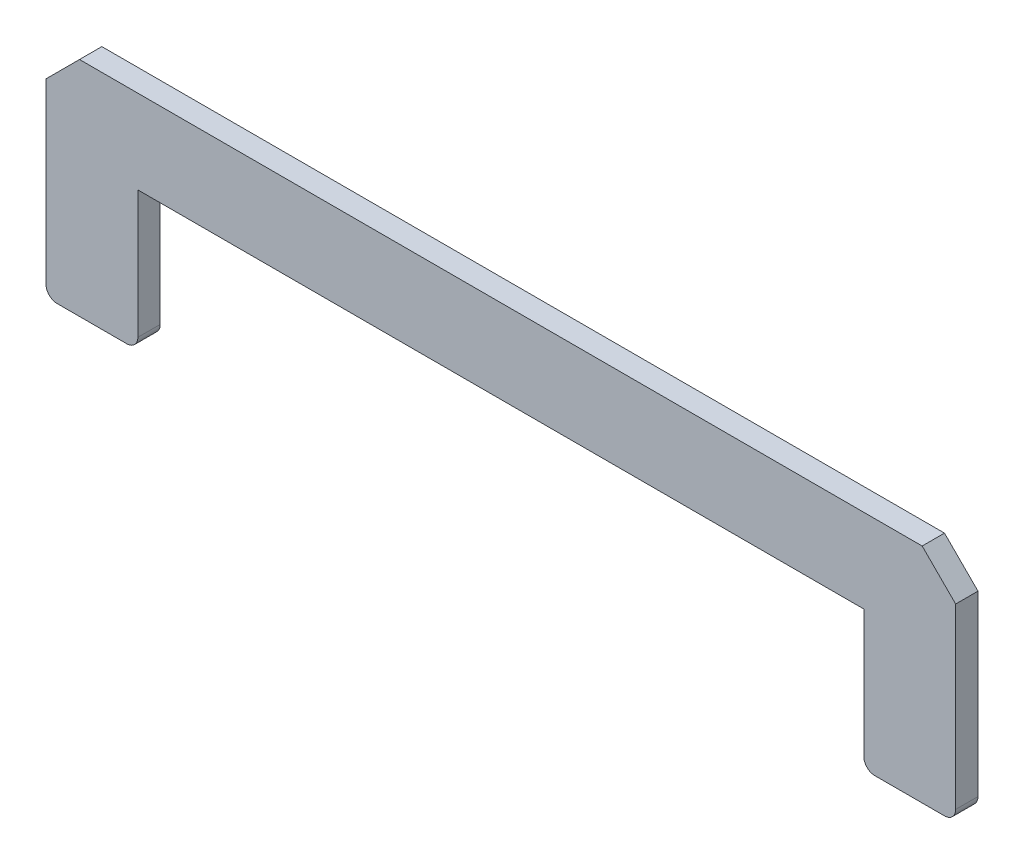
ISO-10303-21;
HEADER;
FILE_DESCRIPTION(('STEP AP214'),'2;1');
FILE_NAME('part.step','',(''),(''),'','','');
FILE_SCHEMA(('AUTOMOTIVE_DESIGN { 1 0 10303 214 1 1 1 1 }'));
ENDSEC;
DATA;
#1=APPLICATION_CONTEXT('core data for automotive mechanical design processes');
#2=APPLICATION_PROTOCOL_DEFINITION('international standard','automotive_design',2000,#1);
#3=PRODUCT_CONTEXT('',#1,'mechanical');
#4=PRODUCT('Part','Part','',(#3));
#5=PRODUCT_RELATED_PRODUCT_CATEGORY('part','',(#4));
#6=PRODUCT_DEFINITION_FORMATION('','',#4);
#7=PRODUCT_DEFINITION_CONTEXT('part definition',#1,'design');
#8=PRODUCT_DEFINITION('design','',#6,#7);
#9=PRODUCT_DEFINITION_SHAPE('','',#8);
#10=(LENGTH_UNIT() NAMED_UNIT(*) SI_UNIT(.MILLI.,.METRE.));
#11=(NAMED_UNIT(*) PLANE_ANGLE_UNIT() SI_UNIT($,.RADIAN.));
#12=(NAMED_UNIT(*) SI_UNIT($,.STERADIAN.) SOLID_ANGLE_UNIT());
#13=UNCERTAINTY_MEASURE_WITH_UNIT(LENGTH_MEASURE(1.E-05),#10,'distance_accuracy_value','');
#14=(GEOMETRIC_REPRESENTATION_CONTEXT(3) GLOBAL_UNCERTAINTY_ASSIGNED_CONTEXT((#13)) GLOBAL_UNIT_ASSIGNED_CONTEXT((#10,
#11,#12)) REPRESENTATION_CONTEXT('',''));
#15=CARTESIAN_POINT('',(0.,0.,0.));
#16=DIRECTION('',(0.,0.,1.));
#17=DIRECTION('',(1.,0.,0.));
#18=AXIS2_PLACEMENT_3D('',#15,#16,#17);
#19=CARTESIAN_POINT('',(16.2941,0.,2.54));
#20=DIRECTION('',(-1.,0.,0.));
#21=DIRECTION('',(0.,-1.,0.));
#22=AXIS2_PLACEMENT_3D('',#19,#20,#21);
#23=PLANE('',#22);
#24=DIRECTION('',(0.,1.,0.));
#25=VECTOR('',#24,1.);
#26=CARTESIAN_POINT('',(16.2941,0.,2.54));
#27=LINE('',#26,#25);
#28=CARTESIAN_POINT('',(16.2941,19.2651924354634,2.54));
#29=VERTEX_POINT('',#28);
#30=CARTESIAN_POINT('',(16.2941,33.782,2.54));
#31=VERTEX_POINT('',#30);
#32=EDGE_CURVE('E135',#29,#31,#27,.T.);
#33=ORIENTED_EDGE('',*,*,#32,.F.);
#34=DIRECTION('',(0.,0.,1.));
#35=VECTOR('',#34,1.);
#36=CARTESIAN_POINT('',(16.2941,19.2651924354634,2.54));
#37=LINE('',#36,#35);
#38=CARTESIAN_POINT('',(16.2941,19.2651924354634,0.));
#39=VERTEX_POINT('',#38);
#40=EDGE_CURVE('E11',#29,#39,#37,.F.);
#41=ORIENTED_EDGE('',*,*,#40,.T.);
#42=DIRECTION('',(0.,1.,0.));
#43=VECTOR('',#42,1.);
#44=CARTESIAN_POINT('',(16.2941,0.,0.));
#45=LINE('',#44,#43);
#46=CARTESIAN_POINT('',(16.2941,33.782,0.));
#47=VERTEX_POINT('',#46);
#48=EDGE_CURVE('E159',#39,#47,#45,.T.);
#49=ORIENTED_EDGE('',*,*,#48,.T.);
#50=DIRECTION('',(0.,0.,-1.));
#51=VECTOR('',#50,1.);
#52=CARTESIAN_POINT('',(16.2941,33.782,2.54));
#53=LINE('',#52,#51);
#54=EDGE_CURVE('E152',#31,#47,#53,.T.);
#55=ORIENTED_EDGE('',*,*,#54,.F.);
#56=EDGE_LOOP('',(#33,#41,#49,#55));
#57=FACE_BOUND('',#56,.T.);
#58=ADVANCED_FACE('F33',(#57),#23,.F.);
#59=CARTESIAN_POINT('',(16.2941,33.782,2.54));
#60=DIRECTION('',(0.,1.,0.));
#61=DIRECTION('',(0.,0.,1.));
#62=AXIS2_PLACEMENT_3D('',#59,#60,#61);
#63=PLANE('',#62);
#64=DIRECTION('',(1.,0.,0.));
#65=VECTOR('',#64,1.);
#66=CARTESIAN_POINT('',(16.2941,33.782,0.));
#67=LINE('',#66,#65);
#68=CARTESIAN_POINT('',(98.8441,33.782,0.));
#69=VERTEX_POINT('',#68);
#70=EDGE_CURVE('E233',#47,#69,#67,.T.);
#71=ORIENTED_EDGE('',*,*,#70,.T.);
#72=DIRECTION('',(0.,0.,-1.));
#73=VECTOR('',#72,1.);
#74=CARTESIAN_POINT('',(98.8441,33.782,2.54));
#75=LINE('',#74,#73);
#76=CARTESIAN_POINT('',(98.8441,33.782,2.54));
#77=VERTEX_POINT('',#76);
#78=EDGE_CURVE('E154',#77,#69,#75,.T.);
#79=ORIENTED_EDGE('',*,*,#78,.F.);
#80=DIRECTION('',(1.,0.,0.));
#81=VECTOR('',#80,1.);
#82=CARTESIAN_POINT('',(16.2941,33.782,2.54));
#83=LINE('',#82,#81);
#84=EDGE_CURVE('E140',#31,#77,#83,.T.);
#85=ORIENTED_EDGE('',*,*,#84,.F.);
#86=ORIENTED_EDGE('',*,*,#54,.T.);
#87=EDGE_LOOP('',(#71,#79,#85,#86));
#88=FACE_BOUND('',#87,.T.);
#89=ADVANCED_FACE('F151',(#88),#63,.F.);
#90=CARTESIAN_POINT('',(98.8441,33.782,2.54));
#91=DIRECTION('',(1.,0.,0.));
#92=DIRECTION('',(0.,0.,-1.));
#93=AXIS2_PLACEMENT_3D('',#90,#91,#92);
#94=PLANE('',#93);
#95=DIRECTION('',(0.,-1.,0.));
#96=VECTOR('',#95,1.);
#97=CARTESIAN_POINT('',(98.8441,33.782,0.));
#98=LINE('',#97,#96);
#99=CARTESIAN_POINT('',(98.8441,19.2651924354634,0.));
#100=VERTEX_POINT('',#99);
#101=EDGE_CURVE('E219',#69,#100,#98,.T.);
#102=ORIENTED_EDGE('',*,*,#101,.T.);
#103=DIRECTION('',(0.,0.,1.));
#104=VECTOR('',#103,1.);
#105=CARTESIAN_POINT('',(98.8441,19.2651924354634,2.54));
#106=LINE('',#105,#104);
#107=CARTESIAN_POINT('',(98.8441,19.2651924354634,2.54));
#108=VERTEX_POINT('',#107);
#109=EDGE_CURVE('E41',#100,#108,#106,.T.);
#110=ORIENTED_EDGE('',*,*,#109,.T.);
#111=DIRECTION('',(0.,-1.,0.));
#112=VECTOR('',#111,1.);
#113=CARTESIAN_POINT('',(98.8441,33.782,2.54));
#114=LINE('',#113,#112);
#115=EDGE_CURVE('E156',#77,#108,#114,.T.);
#116=ORIENTED_EDGE('',*,*,#115,.F.);
#117=ORIENTED_EDGE('',*,*,#78,.T.);
#118=EDGE_LOOP('',(#102,#110,#116,#117));
#119=FACE_BOUND('',#118,.T.);
#120=ADVANCED_FACE('F217',(#119),#94,.F.);
#121=CARTESIAN_POINT('',(109.2962,33.782,2.54));
#122=DIRECTION('',(-1.,0.,0.));
#123=DIRECTION('',(0.,0.,1.));
#124=AXIS2_PLACEMENT_3D('',#121,#122,#123);
#125=PLANE('',#124);
#126=DIRECTION('',(0.,1.,0.));
#127=VECTOR('',#126,1.);
#128=CARTESIAN_POINT('',(109.2962,33.782,2.54));
#129=LINE('',#128,#127);
#130=CARTESIAN_POINT('',(109.2962,19.2651924354634,2.54));
#131=VERTEX_POINT('',#130);
#132=CARTESIAN_POINT('',(109.2962,39.497,2.54));
#133=VERTEX_POINT('',#132);
#134=EDGE_CURVE('E223',#131,#133,#129,.T.);
#135=ORIENTED_EDGE('',*,*,#134,.F.);
#136=DIRECTION('',(0.,0.,1.));
#137=VECTOR('',#136,1.);
#138=CARTESIAN_POINT('',(109.2962,19.2651924354634,2.54));
#139=LINE('',#138,#137);
#140=CARTESIAN_POINT('',(109.2962,19.2651924354634,0.));
#141=VERTEX_POINT('',#140);
#142=EDGE_CURVE('E198',#131,#141,#139,.F.);
#143=ORIENTED_EDGE('',*,*,#142,.T.);
#144=DIRECTION('',(0.,1.,0.));
#145=VECTOR('',#144,1.);
#146=CARTESIAN_POINT('',(109.2962,33.782,0.));
#147=LINE('',#146,#145);
#148=CARTESIAN_POINT('',(109.2962,39.497,0.));
#149=VERTEX_POINT('',#148);
#150=EDGE_CURVE('E237',#141,#149,#147,.T.);
#151=ORIENTED_EDGE('',*,*,#150,.T.);
#152=DIRECTION('',(0.,0.,1.));
#153=VECTOR('',#152,1.);
#154=CARTESIAN_POINT('',(109.2962,39.497,2.54));
#155=LINE('',#154,#153);
#156=EDGE_CURVE('E176',#149,#133,#155,.T.);
#157=ORIENTED_EDGE('',*,*,#156,.T.);
#158=EDGE_LOOP('',(#135,#143,#151,#157));
#159=FACE_BOUND('',#158,.T.);
#160=ADVANCED_FACE('F272',(#159),#125,.F.);
#161=CARTESIAN_POINT('',(109.2962,43.307,2.54));
#162=DIRECTION('',(0.,-1.,0.));
#163=DIRECTION('',(1.,0.,0.));
#164=AXIS2_PLACEMENT_3D('',#161,#162,#163);
#165=PLANE('',#164);
#166=DIRECTION('',(-1.,0.,0.));
#167=VECTOR('',#166,1.);
#168=CARTESIAN_POINT('',(109.2962,43.307,2.54));
#169=LINE('',#168,#167);
#170=CARTESIAN_POINT('',(105.4862,43.307,2.54));
#171=VERTEX_POINT('',#170);
#172=CARTESIAN_POINT('',(9.65200000000002,43.307,2.54));
#173=VERTEX_POINT('',#172);
#174=EDGE_CURVE('E225',#171,#173,#169,.T.);
#175=ORIENTED_EDGE('',*,*,#174,.F.);
#176=DIRECTION('',(0.,0.,-1.));
#177=VECTOR('',#176,1.);
#178=CARTESIAN_POINT('',(105.4862,43.307,2.54));
#179=LINE('',#178,#177);
#180=CARTESIAN_POINT('',(105.4862,43.307,0.));
#181=VERTEX_POINT('',#180);
#182=EDGE_CURVE('E163',#171,#181,#179,.T.);
#183=ORIENTED_EDGE('',*,*,#182,.T.);
#184=DIRECTION('',(-1.,0.,0.));
#185=VECTOR('',#184,1.);
#186=CARTESIAN_POINT('',(109.2962,43.307,0.));
#187=LINE('',#186,#185);
#188=CARTESIAN_POINT('',(9.65200000000001,43.307,0.));
#189=VERTEX_POINT('',#188);
#190=EDGE_CURVE('E239',#181,#189,#187,.T.);
#191=ORIENTED_EDGE('',*,*,#190,.T.);
#192=DIRECTION('',(0.,0.,1.));
#193=VECTOR('',#192,1.);
#194=CARTESIAN_POINT('',(9.65200000000001,43.307,2.54));
#195=LINE('',#194,#193);
#196=EDGE_CURVE('E161',#189,#173,#195,.T.);
#197=ORIENTED_EDGE('',*,*,#196,.T.);
#198=EDGE_LOOP('',(#175,#183,#191,#197));
#199=FACE_BOUND('',#198,.T.);
#200=ADVANCED_FACE('F281',(#199),#165,.F.);
#201=CARTESIAN_POINT('',(5.842,43.307,2.54));
#202=DIRECTION('',(1.,0.,0.));
#203=DIRECTION('',(0.,1.,0.));
#204=AXIS2_PLACEMENT_3D('',#201,#202,#203);
#205=PLANE('',#204);
#206=DIRECTION('',(0.,-1.,0.));
#207=VECTOR('',#206,1.);
#208=CARTESIAN_POINT('',(5.842,43.307,0.));
#209=LINE('',#208,#207);
#210=CARTESIAN_POINT('',(5.842,39.497,0.));
#211=VERTEX_POINT('',#210);
#212=CARTESIAN_POINT('',(5.842,19.2651924354634,0.));
#213=VERTEX_POINT('',#212);
#214=EDGE_CURVE('E147',#211,#213,#209,.T.);
#215=ORIENTED_EDGE('',*,*,#214,.T.);
#216=DIRECTION('',(0.,0.,1.));
#217=VECTOR('',#216,1.);
#218=CARTESIAN_POINT('',(5.842,19.2651924354634,2.54));
#219=LINE('',#218,#217);
#220=CARTESIAN_POINT('',(5.842,19.2651924354634,2.54));
#221=VERTEX_POINT('',#220);
#222=EDGE_CURVE('E207',#213,#221,#219,.T.);
#223=ORIENTED_EDGE('',*,*,#222,.T.);
#224=DIRECTION('',(0.,-1.,0.));
#225=VECTOR('',#224,1.);
#226=CARTESIAN_POINT('',(5.842,43.307,2.54));
#227=LINE('',#226,#225);
#228=CARTESIAN_POINT('',(5.842,39.497,2.54));
#229=VERTEX_POINT('',#228);
#230=EDGE_CURVE('E165',#229,#221,#227,.T.);
#231=ORIENTED_EDGE('',*,*,#230,.F.);
#232=DIRECTION('',(0.,0.,-1.));
#233=VECTOR('',#232,1.);
#234=CARTESIAN_POINT('',(5.842,39.497,2.54));
#235=LINE('',#234,#233);
#236=EDGE_CURVE('E183',#229,#211,#235,.T.);
#237=ORIENTED_EDGE('',*,*,#236,.T.);
#238=EDGE_LOOP('',(#215,#223,#231,#237));
#239=FACE_BOUND('',#238,.T.);
#240=ADVANCED_FACE('F243',(#239),#205,.F.);
#241=CARTESIAN_POINT('',(0.,0.,2.54));
#242=DIRECTION('',(0.,0.,-1.));
#243=DIRECTION('',(-1.,0.,0.));
#244=AXIS2_PLACEMENT_3D('',#241,#242,#243);
#245=PLANE('',#244);
#246=DIRECTION('',(-1.,0.,0.));
#247=VECTOR('',#246,1.);
#248=CARTESIAN_POINT('',(42.8674688112568,17.9951924354634,2.54));
#249=LINE('',#248,#247);
#250=CARTESIAN_POINT('',(108.0262,17.9951924354634,2.54));
#251=VERTEX_POINT('',#250);
#252=CARTESIAN_POINT('',(100.1141,17.9951924354634,2.54));
#253=VERTEX_POINT('',#252);
#254=EDGE_CURVE('E255',#251,#253,#249,.T.);
#255=ORIENTED_EDGE('',*,*,#254,.F.);
#256=CARTESIAN_POINT('',(108.0262,19.2651924354634,2.54));
#257=DIRECTION('',(0.,0.,-1.));
#258=DIRECTION('',(-1.,0.,0.));
#259=AXIS2_PLACEMENT_3D('',#256,#257,#258);
#260=CIRCLE('',#259,1.27);
#261=EDGE_CURVE('E196',#251,#131,#260,.F.);
#262=ORIENTED_EDGE('',*,*,#261,.T.);
#263=ORIENTED_EDGE('',*,*,#134,.T.);
#264=DIRECTION('',(0.707106781186546,-0.707106781186549,0.));
#265=VECTOR('',#264,1.);
#266=CARTESIAN_POINT('',(105.4862,43.307,2.54));
#267=LINE('',#266,#265);
#268=EDGE_CURVE('E181',#133,#171,#267,.F.);
#269=ORIENTED_EDGE('',*,*,#268,.T.);
#270=ORIENTED_EDGE('',*,*,#174,.T.);
#271=DIRECTION('',(0.707106781186548,0.707106781186548,0.));
#272=VECTOR('',#271,1.);
#273=CARTESIAN_POINT('',(5.842,39.497,2.54));
#274=LINE('',#273,#272);
#275=EDGE_CURVE('E179',#173,#229,#274,.F.);
#276=ORIENTED_EDGE('',*,*,#275,.T.);
#277=ORIENTED_EDGE('',*,*,#230,.T.);
#278=CARTESIAN_POINT('',(7.112,19.2651924354634,2.54));
#279=DIRECTION('',(0.,0.,-1.));
#280=DIRECTION('',(-1.,0.,0.));
#281=AXIS2_PLACEMENT_3D('',#278,#279,#280);
#282=CIRCLE('',#281,1.27);
#283=CARTESIAN_POINT('',(7.112,17.9951924354634,2.54));
#284=VERTEX_POINT('',#283);
#285=EDGE_CURVE('E194',#221,#284,#282,.F.);
#286=ORIENTED_EDGE('',*,*,#285,.T.);
#287=DIRECTION('',(-1.,0.,0.));
#288=VECTOR('',#287,1.);
#289=CARTESIAN_POINT('',(5.84200000000001,17.9951924354634,2.54));
#290=LINE('',#289,#288);
#291=CARTESIAN_POINT('',(15.0241,17.9951924354634,2.54));
#292=VERTEX_POINT('',#291);
#293=EDGE_CURVE('E248',#292,#284,#290,.T.);
#294=ORIENTED_EDGE('',*,*,#293,.F.);
#295=CARTESIAN_POINT('',(15.0241,19.2651924354634,2.54));
#296=DIRECTION('',(0.,0.,-1.));
#297=DIRECTION('',(-1.,0.,0.));
#298=AXIS2_PLACEMENT_3D('',#295,#296,#297);
#299=CIRCLE('',#298,1.27);
#300=EDGE_CURVE('E143',#292,#29,#299,.F.);
#301=ORIENTED_EDGE('',*,*,#300,.T.);
#302=ORIENTED_EDGE('',*,*,#32,.T.);
#303=ORIENTED_EDGE('',*,*,#84,.T.);
#304=ORIENTED_EDGE('',*,*,#115,.T.);
#305=CARTESIAN_POINT('',(100.1141,19.2651924354634,2.54));
#306=DIRECTION('',(0.,0.,-1.));
#307=DIRECTION('',(-1.,0.,0.));
#308=AXIS2_PLACEMENT_3D('',#305,#306,#307);
#309=CIRCLE('',#308,1.27);
#310=EDGE_CURVE('E192',#108,#253,#309,.F.);
#311=ORIENTED_EDGE('',*,*,#310,.T.);
#312=EDGE_LOOP('',(#255,#262,#263,#269,#270,#276,#277,#286,#294,#301,#302,#303,#304,#311));
#313=FACE_BOUND('',#312,.T.);
#314=ADVANCED_FACE('F138',(#313),#245,.F.);
#315=CARTESIAN_POINT('',(0.,0.,0.));
#316=DIRECTION('',(0.,0.,-1.));
#317=DIRECTION('',(-1.,0.,0.));
#318=AXIS2_PLACEMENT_3D('',#315,#316,#317);
#319=PLANE('',#318);
#320=ORIENTED_EDGE('',*,*,#150,.F.);
#321=CARTESIAN_POINT('',(108.0262,19.2651924354634,0.));
#322=DIRECTION('',(0.,0.,-1.));
#323=DIRECTION('',(-1.,0.,0.));
#324=AXIS2_PLACEMENT_3D('',#321,#322,#323);
#325=CIRCLE('',#324,1.27);
#326=CARTESIAN_POINT('',(108.0262,17.9951924354634,0.));
#327=VERTEX_POINT('',#326);
#328=EDGE_CURVE('E205',#141,#327,#325,.T.);
#329=ORIENTED_EDGE('',*,*,#328,.T.);
#330=DIRECTION('',(-1.,0.,0.));
#331=VECTOR('',#330,1.);
#332=CARTESIAN_POINT('',(42.8674688112568,17.9951924354634,0.));
#333=LINE('',#332,#331);
#334=CARTESIAN_POINT('',(100.1141,17.9951924354634,0.));
#335=VERTEX_POINT('',#334);
#336=EDGE_CURVE('E251',#327,#335,#333,.T.);
#337=ORIENTED_EDGE('',*,*,#336,.T.);
#338=CARTESIAN_POINT('',(100.1141,19.2651924354634,0.));
#339=DIRECTION('',(0.,0.,-1.));
#340=DIRECTION('',(-1.,0.,0.));
#341=AXIS2_PLACEMENT_3D('',#338,#339,#340);
#342=CIRCLE('',#341,1.27);
#343=EDGE_CURVE('E202',#335,#100,#342,.T.);
#344=ORIENTED_EDGE('',*,*,#343,.T.);
#345=ORIENTED_EDGE('',*,*,#101,.F.);
#346=ORIENTED_EDGE('',*,*,#70,.F.);
#347=ORIENTED_EDGE('',*,*,#48,.F.);
#348=CARTESIAN_POINT('',(15.0241,19.2651924354634,0.));
#349=DIRECTION('',(0.,0.,-1.));
#350=DIRECTION('',(-1.,0.,0.));
#351=AXIS2_PLACEMENT_3D('',#348,#349,#350);
#352=CIRCLE('',#351,1.27);
#353=CARTESIAN_POINT('',(15.0241,17.9951924354634,0.));
#354=VERTEX_POINT('',#353);
#355=EDGE_CURVE('E200',#39,#354,#352,.T.);
#356=ORIENTED_EDGE('',*,*,#355,.T.);
#357=DIRECTION('',(-1.,0.,0.));
#358=VECTOR('',#357,1.);
#359=CARTESIAN_POINT('',(5.84200000000001,17.9951924354634,0.));
#360=LINE('',#359,#358);
#361=CARTESIAN_POINT('',(7.112,17.9951924354634,0.));
#362=VERTEX_POINT('',#361);
#363=EDGE_CURVE('E234',#354,#362,#360,.T.);
#364=ORIENTED_EDGE('',*,*,#363,.T.);
#365=CARTESIAN_POINT('',(7.112,19.2651924354634,0.));
#366=DIRECTION('',(0.,0.,-1.));
#367=DIRECTION('',(-1.,0.,0.));
#368=AXIS2_PLACEMENT_3D('',#365,#366,#367);
#369=CIRCLE('',#368,1.27);
#370=EDGE_CURVE('E48',#362,#213,#369,.T.);
#371=ORIENTED_EDGE('',*,*,#370,.T.);
#372=ORIENTED_EDGE('',*,*,#214,.F.);
#373=DIRECTION('',(-0.707106781186548,-0.707106781186548,0.));
#374=VECTOR('',#373,1.);
#375=CARTESIAN_POINT('',(-16.8275,16.8275,0.));
#376=LINE('',#375,#374);
#377=EDGE_CURVE('E171',#211,#189,#376,.F.);
#378=ORIENTED_EDGE('',*,*,#377,.T.);
#379=ORIENTED_EDGE('',*,*,#190,.F.);
#380=DIRECTION('',(-0.707106781186546,0.707106781186549,0.));
#381=VECTOR('',#380,1.);
#382=CARTESIAN_POINT('',(74.3966000000002,74.3965999999999,0.));
#383=LINE('',#382,#381);
#384=EDGE_CURVE('E173',#181,#149,#383,.F.);
#385=ORIENTED_EDGE('',*,*,#384,.T.);
#386=EDGE_LOOP('',(#320,#329,#337,#344,#345,#346,#347,#356,#364,#371,#372,#378,#379,#385));
#387=FACE_BOUND('',#386,.T.);
#388=ADVANCED_FACE('F265',(#387),#319,.T.);
#389=CARTESIAN_POINT('',(105.4862,43.307,2.54));
#390=DIRECTION('',(-0.707106781186549,-0.707106781186546,0.));
#391=DIRECTION('',(0.,0.,-1.));
#392=AXIS2_PLACEMENT_3D('',#389,#390,#391);
#393=PLANE('',#392);
#394=ORIENTED_EDGE('',*,*,#268,.F.);
#395=ORIENTED_EDGE('',*,*,#156,.F.);
#396=ORIENTED_EDGE('',*,*,#384,.F.);
#397=ORIENTED_EDGE('',*,*,#182,.F.);
#398=EDGE_LOOP('',(#394,#395,#396,#397));
#399=FACE_BOUND('',#398,.T.);
#400=ADVANCED_FACE('F277',(#399),#393,.F.);
#401=CARTESIAN_POINT('',(5.842,39.497,2.54));
#402=DIRECTION('',(0.707106781186548,-0.707106781186548,0.));
#403=DIRECTION('',(0.,0.,-1.));
#404=AXIS2_PLACEMENT_3D('',#401,#402,#403);
#405=PLANE('',#404);
#406=ORIENTED_EDGE('',*,*,#275,.F.);
#407=ORIENTED_EDGE('',*,*,#196,.F.);
#408=ORIENTED_EDGE('',*,*,#377,.F.);
#409=ORIENTED_EDGE('',*,*,#236,.F.);
#410=EDGE_LOOP('',(#406,#407,#408,#409));
#411=FACE_BOUND('',#410,.T.);
#412=ADVANCED_FACE('F285',(#411),#405,.F.);
#413=CARTESIAN_POINT('',(5.84200000000001,17.9951924354634,0.));
#414=DIRECTION('',(0.,1.,0.));
#415=DIRECTION('',(0.,0.,1.));
#416=AXIS2_PLACEMENT_3D('',#413,#414,#415);
#417=PLANE('',#416);
#418=ORIENTED_EDGE('',*,*,#293,.T.);
#419=DIRECTION('',(0.,0.,1.));
#420=VECTOR('',#419,1.);
#421=CARTESIAN_POINT('',(7.112,17.9951924354634,0.));
#422=LINE('',#421,#420);
#423=EDGE_CURVE('E56',#284,#362,#422,.F.);
#424=ORIENTED_EDGE('',*,*,#423,.T.);
#425=ORIENTED_EDGE('',*,*,#363,.F.);
#426=DIRECTION('',(0.,0.,1.));
#427=VECTOR('',#426,1.);
#428=CARTESIAN_POINT('',(15.0241,17.9951924354634,0.));
#429=LINE('',#428,#427);
#430=EDGE_CURVE('E210',#354,#292,#429,.T.);
#431=ORIENTED_EDGE('',*,*,#430,.T.);
#432=EDGE_LOOP('',(#418,#424,#425,#431));
#433=FACE_BOUND('',#432,.T.);
#434=ADVANCED_FACE('F249',(#433),#417,.F.);
#435=CARTESIAN_POINT('',(42.8674688112568,17.9951924354634,0.));
#436=DIRECTION('',(0.,1.,0.));
#437=DIRECTION('',(0.,0.,1.));
#438=AXIS2_PLACEMENT_3D('',#435,#436,#437);
#439=PLANE('',#438);
#440=ORIENTED_EDGE('',*,*,#336,.F.);
#441=DIRECTION('',(0.,0.,1.));
#442=VECTOR('',#441,1.);
#443=CARTESIAN_POINT('',(108.0262,17.9951924354634,0.));
#444=LINE('',#443,#442);
#445=EDGE_CURVE('E188',#327,#251,#444,.T.);
#446=ORIENTED_EDGE('',*,*,#445,.T.);
#447=ORIENTED_EDGE('',*,*,#254,.T.);
#448=DIRECTION('',(0.,0.,1.));
#449=VECTOR('',#448,1.);
#450=CARTESIAN_POINT('',(100.1141,17.9951924354634,0.));
#451=LINE('',#450,#449);
#452=EDGE_CURVE('E186',#253,#335,#451,.F.);
#453=ORIENTED_EDGE('',*,*,#452,.T.);
#454=EDGE_LOOP('',(#440,#446,#447,#453));
#455=FACE_BOUND('',#454,.T.);
#456=ADVANCED_FACE('F261',(#455),#439,.F.);
#457=CARTESIAN_POINT('',(108.0262,19.2651924354634,0.));
#458=DIRECTION('',(0.,0.,1.));
#459=DIRECTION('',(1.,0.,0.));
#460=AXIS2_PLACEMENT_3D('',#457,#458,#459);
#461=CYLINDRICAL_SURFACE('',#460,1.27);
#462=ORIENTED_EDGE('',*,*,#328,.F.);
#463=ORIENTED_EDGE('',*,*,#142,.F.);
#464=ORIENTED_EDGE('',*,*,#261,.F.);
#465=ORIENTED_EDGE('',*,*,#445,.F.);
#466=EDGE_LOOP('',(#462,#463,#464,#465));
#467=FACE_BOUND('',#466,.T.);
#468=ADVANCED_FACE('F268',(#467),#461,.T.);
#469=CARTESIAN_POINT('',(7.112,19.2651924354634,2.54));
#470=DIRECTION('',(0.,0.,1.));
#471=DIRECTION('',(1.,0.,0.));
#472=AXIS2_PLACEMENT_3D('',#469,#470,#471);
#473=CYLINDRICAL_SURFACE('',#472,1.27);
#474=ORIENTED_EDGE('',*,*,#370,.F.);
#475=ORIENTED_EDGE('',*,*,#423,.F.);
#476=ORIENTED_EDGE('',*,*,#285,.F.);
#477=ORIENTED_EDGE('',*,*,#222,.F.);
#478=EDGE_LOOP('',(#474,#475,#476,#477));
#479=FACE_BOUND('',#478,.T.);
#480=ADVANCED_FACE('F247',(#479),#473,.T.);
#481=CARTESIAN_POINT('',(100.1141,19.2651924354634,2.54));
#482=DIRECTION('',(0.,0.,1.));
#483=DIRECTION('',(1.,0.,0.));
#484=AXIS2_PLACEMENT_3D('',#481,#482,#483);
#485=CYLINDRICAL_SURFACE('',#484,1.27);
#486=ORIENTED_EDGE('',*,*,#343,.F.);
#487=ORIENTED_EDGE('',*,*,#452,.F.);
#488=ORIENTED_EDGE('',*,*,#310,.F.);
#489=ORIENTED_EDGE('',*,*,#109,.F.);
#490=EDGE_LOOP('',(#486,#487,#488,#489));
#491=FACE_BOUND('',#490,.T.);
#492=ADVANCED_FACE('F263',(#491),#485,.T.);
#493=CARTESIAN_POINT('',(15.0241,19.2651924354634,0.));
#494=DIRECTION('',(0.,0.,1.));
#495=DIRECTION('',(1.,0.,0.));
#496=AXIS2_PLACEMENT_3D('',#493,#494,#495);
#497=CYLINDRICAL_SURFACE('',#496,1.27);
#498=ORIENTED_EDGE('',*,*,#355,.F.);
#499=ORIENTED_EDGE('',*,*,#40,.F.);
#500=ORIENTED_EDGE('',*,*,#300,.F.);
#501=ORIENTED_EDGE('',*,*,#430,.F.);
#502=EDGE_LOOP('',(#498,#499,#500,#501));
#503=FACE_BOUND('',#502,.T.);
#504=ADVANCED_FACE('F35',(#503),#497,.T.);
#505=CLOSED_SHELL('',(#58,#89,#120,#160,#200,#240,#314,#388,#400,#412,#434,#456,#468,#480,#492,#504));
#506=MANIFOLD_SOLID_BREP('B2',#505);
#507=ADVANCED_BREP_SHAPE_REPRESENTATION('',(#18,#506),#14);
#508=SHAPE_DEFINITION_REPRESENTATION(#9,#507);
ENDSEC;
END-ISO-10303-21;
